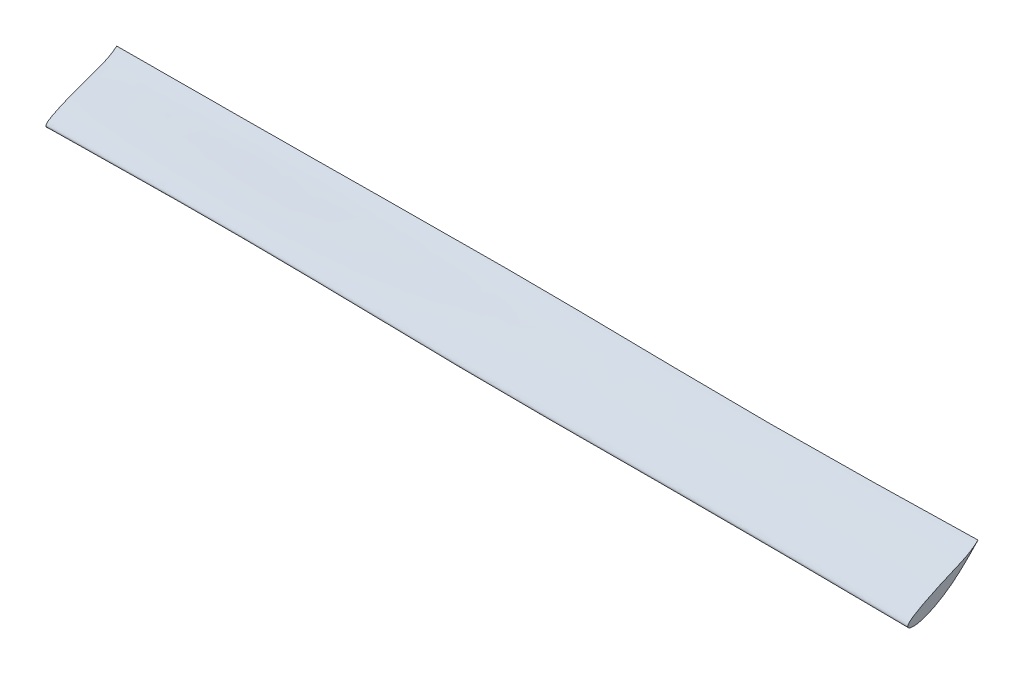
ISO-10303-21;
HEADER;
FILE_DESCRIPTION(('STEP AP214'),'2;1');
FILE_NAME('part.step','',(''),(''),'','','');
FILE_SCHEMA(('AUTOMOTIVE_DESIGN { 1 0 10303 214 1 1 1 1 }'));
ENDSEC;
DATA;
#1=APPLICATION_CONTEXT('core data for automotive mechanical design processes');
#2=APPLICATION_PROTOCOL_DEFINITION('international standard','automotive_design',2000,#1);
#3=PRODUCT_CONTEXT('',#1,'mechanical');
#4=PRODUCT('Part','Part','',(#3));
#5=PRODUCT_RELATED_PRODUCT_CATEGORY('part','',(#4));
#6=PRODUCT_DEFINITION_FORMATION('','',#4);
#7=PRODUCT_DEFINITION_CONTEXT('part definition',#1,'design');
#8=PRODUCT_DEFINITION('design','',#6,#7);
#9=PRODUCT_DEFINITION_SHAPE('','',#8);
#10=(LENGTH_UNIT() NAMED_UNIT(*) SI_UNIT(.MILLI.,.METRE.));
#11=(NAMED_UNIT(*) PLANE_ANGLE_UNIT() SI_UNIT($,.RADIAN.));
#12=(NAMED_UNIT(*) SI_UNIT($,.STERADIAN.) SOLID_ANGLE_UNIT());
#13=UNCERTAINTY_MEASURE_WITH_UNIT(LENGTH_MEASURE(1.E-05),#10,'distance_accuracy_value','');
#14=(GEOMETRIC_REPRESENTATION_CONTEXT(3) GLOBAL_UNCERTAINTY_ASSIGNED_CONTEXT((#13)) GLOBAL_UNIT_ASSIGNED_CONTEXT((#10,
#11,#12)) REPRESENTATION_CONTEXT('',''));
#15=CARTESIAN_POINT('',(0.,0.,0.));
#16=DIRECTION('',(0.,0.,1.));
#17=DIRECTION('',(1.,0.,0.));
#18=AXIS2_PLACEMENT_3D('',#15,#16,#17);
#19=CARTESIAN_POINT('',(534.287503140715,23.5445932351853,-31.5919798363942));
#20=DIRECTION('',(1.,0.,0.));
#21=DIRECTION('',(0.,0.,-1.));
#22=AXIS2_PLACEMENT_3D('',#19,#20,#21);
#23=PLANE('',#22);
#24=CARTESIAN_POINT('',(534.287503140715,35.4339005781969,-54.10357532692));
#25=CARTESIAN_POINT('',(534.287503140715,34.2381881895794,-52.8955230255901));
#26=CARTESIAN_POINT('',(534.287503140715,32.1428343468748,-50.2360352412443));
#27=CARTESIAN_POINT('',(534.287503140715,29.6938278537414,-45.7981714533343));
#28=CARTESIAN_POINT('',(534.287503140715,27.6735843988713,-41.1787572420392));
#29=CARTESIAN_POINT('',(534.287503140715,25.7176513120445,-36.5225225253925));
#30=CARTESIAN_POINT('',(534.287503140715,23.695720292381,-31.894572560708));
#31=CARTESIAN_POINT('',(534.287503140715,21.5984931931603,-27.3081732984461));
#32=CARTESIAN_POINT('',(534.287503140715,19.4455955790061,-22.7564956841988));
#33=CARTESIAN_POINT('',(534.287503140715,17.5082778691136,-19.0387125988831));
#34=CARTESIAN_POINT('',(534.287503140715,15.8538747820841,-16.1253914306171));
#35=CARTESIAN_POINT('',(534.287503140715,14.7486241627605,-14.3447709325331));
#36=CARTESIAN_POINT('',(534.287503140715,13.798577758102,-12.9569555017875));
#37=CARTESIAN_POINT('',(534.287503140715,13.0042141147821,-11.9524705075148));
#38=CARTESIAN_POINT('',(534.287503140715,11.9509988926326,-10.8600952656026));
#39=CARTESIAN_POINT('',(534.287503140715,10.9287179976586,-10.3342016372565));
#40=CARTESIAN_POINT('',(534.287503140715,10.2024209056551,-10.6788708378612));
#41=B_SPLINE_CURVE_WITH_KNOTS('',3,(#24,#25,#26,#27,#28,#29,#30,#31,#32,#33,#34,#35,#36,#37,#38,
#39,#40),.UNSPECIFIED.,.F.,.F.,(4,1,1,1,1,1,1,1,1,1,1,1,1,1,4),(0.,0.0994502667406111,
0.197535442889514,0.296052562977772,0.394806356808814,0.493450979662712,0.591940996969297,
0.690286731259081,0.788438582066012,0.837480949450307,0.886562535047494,0.911178481655704,
0.935996245563337,0.961487145328943,1.),.UNSPECIFIED.);
#42=CARTESIAN_POINT('',(534.287503140715,10.2024209056551,-10.6788708378612));
#43=VERTEX_POINT('',#42);
#44=CARTESIAN_POINT('',(534.287503140715,35.4339005781969,-54.10357532692));
#45=VERTEX_POINT('',#44);
#46=EDGE_CURVE('E60',#43,#45,#41,.F.);
#47=ORIENTED_EDGE('',*,*,#46,.F.);
#48=CARTESIAN_POINT('',(534.287503140715,10.2024209056551,-10.6788708378612));
#49=CARTESIAN_POINT('',(534.287503140715,9.53216321875651,-11.1904140364192));
#50=CARTESIAN_POINT('',(534.287503140715,9.14745858945485,-12.4362131774804));
#51=CARTESIAN_POINT('',(534.287503140715,9.05729615795471,-14.1752019618341));
#52=CARTESIAN_POINT('',(534.287503140715,9.15989810619456,-15.5901834868764));
#53=CARTESIAN_POINT('',(534.287503140715,9.43036237564233,-17.3559755452917));
#54=CARTESIAN_POINT('',(534.287503140715,9.96453582628308,-19.4660487541451));
#55=CARTESIAN_POINT('',(534.287503140715,11.0827536415392,-22.6853781510137));
#56=CARTESIAN_POINT('',(534.287503140715,12.8232789365591,-26.5267046993073));
#57=CARTESIAN_POINT('',(534.287503140715,15.2532400414026,-30.9385941988985));
#58=CARTESIAN_POINT('',(534.287503140715,17.9854624447831,-35.1779101738743));
#59=CARTESIAN_POINT('',(534.287503140715,21.0567921584213,-39.2152051247754));
#60=CARTESIAN_POINT('',(534.287503140715,24.3934392452951,-43.0946377459128));
#61=CARTESIAN_POINT('',(534.287503140715,27.9556329108987,-46.834343905403));
#62=CARTESIAN_POINT('',(534.287503140715,31.6525993706431,-50.4968423811324));
#63=CARTESIAN_POINT('',(534.287503140715,34.1843384422545,-52.8862952058577));
#64=CARTESIAN_POINT('',(534.287503140715,35.4339005781969,-54.10357532692));
#65=B_SPLINE_CURVE_WITH_KNOTS('',3,(#48,#49,#50,#51,#52,#53,#54,#55,#56,#57,#58,#59,#60,#61,#62,
#63,#64),.UNSPECIFIED.,.F.,.F.,(4,1,1,1,1,1,1,1,1,1,1,1,1,1,4),(0.,0.0439009675766793,
0.0724931974140234,0.0990463982397024,0.124643035702787,0.174283288293371,0.222881713336981,
0.31883035285832,0.41429919096017,0.509891636581509,0.60612378963281,0.703302686626897,
0.801511361886123,0.900533646948853,1.),.UNSPECIFIED.);
#66=EDGE_CURVE('E96',#45,#43,#65,.F.);
#67=ORIENTED_EDGE('',*,*,#66,.F.);
#68=EDGE_LOOP('',(#47,#67));
#69=FACE_BOUND('',#68,.T.);
#70=ADVANCED_FACE('F57',(#69),#23,.T.);
#71=CARTESIAN_POINT('',(0.,23.484223991255,-31.7011060039401));
#72=DIRECTION('',(1.,0.,0.));
#73=DIRECTION('',(0.,0.,-1.));
#74=AXIS2_PLACEMENT_3D('',#71,#72,#73);
#75=PLANE('',#74);
#76=CARTESIAN_POINT('',(0.,33.4718637070637,-54.3097643297301));
#77=CARTESIAN_POINT('',(0.,32.395776073136,-53.0586742504488));
#78=CARTESIAN_POINT('',(0.,30.5468507342221,-50.3408636441683));
#79=CARTESIAN_POINT('',(0.,28.476047650665,-45.8767302196085));
#80=CARTESIAN_POINT('',(0.,26.8328108478623,-41.2658512957863));
#81=CARTESIAN_POINT('',(0.,25.2543553945098,-36.623674473178));
#82=CARTESIAN_POINT('',(0.,23.6100632017207,-32.0044143131714));
#83=CARTESIAN_POINT('',(0.,21.8900292839443,-27.4202880068344));
#84=CARTESIAN_POINT('',(0.,20.1137239707885,-22.8660129390922));
#85=CARTESIAN_POINT('',(0.,18.4896405150433,-19.13397699365));
#86=CARTESIAN_POINT('',(0.,17.084988176991,-16.2002424969715));
#87=CARTESIAN_POINT('',(0.,16.1353498503008,-14.4007637609852));
#88=CARTESIAN_POINT('',(0.,15.3093801529886,-12.9922393722692));
#89=CARTESIAN_POINT('',(0.,14.6081852314093,-11.9655257350319));
#90=CARTESIAN_POINT('',(0.,13.662257675184,-10.8361332014463));
#91=CARTESIAN_POINT('',(0.,12.7078642109712,-10.2574690494851));
#92=CARTESIAN_POINT('',(0.,11.9810754589233,-10.542010721781));
#93=B_SPLINE_CURVE_WITH_KNOTS('',3,(#76,#77,#78,#79,#80,#81,#82,#83,#84,#85,#86,#87,#88,#89,#90,
#91,#92),.UNSPECIFIED.,.F.,.F.,(4,1,1,1,1,1,1,1,1,1,1,1,1,1,4),(0.,0.0994502667406111,
0.197535442889514,0.296052562977772,0.394806356808814,0.493450979662712,0.591940996969297,
0.690286731259081,0.788438582066012,0.837480949450307,0.886562535047494,0.911178481655704,
0.935996245563337,0.961487145328943,1.),.UNSPECIFIED.);
#94=CARTESIAN_POINT('',(0.,33.4718637070637,-54.3097643297301));
#95=VERTEX_POINT('',#94);
#96=CARTESIAN_POINT('',(0.,11.9810754589233,-10.542010721781));
#97=VERTEX_POINT('',#96);
#98=EDGE_CURVE('E13',#95,#97,#93,.T.);
#99=ORIENTED_EDGE('',*,*,#98,.F.);
#100=CARTESIAN_POINT('',(0.,11.9810754589233,-10.542010721781));
#101=CARTESIAN_POINT('',(0.,11.297240795926,-10.9919689316582));
#102=CARTESIAN_POINT('',(0.,10.8401547295533,-12.1724139891022));
#103=CARTESIAN_POINT('',(0.,10.6348750572766,-13.8504860760179));
#104=CARTESIAN_POINT('',(0.,10.6382631297944,-15.2278368902834));
#105=CARTESIAN_POINT('',(0.,10.7804276026314,-16.9563295140538));
#106=CARTESIAN_POINT('',(0.,11.1546378085893,-19.0361417787975));
#107=CARTESIAN_POINT('',(0.,12.0192446516231,-22.2298709050762));
#108=CARTESIAN_POINT('',(0.,13.4443570594694,-26.0682083226455));
#109=CARTESIAN_POINT('',(0.,15.4984768125264,-30.5058941070354));
#110=CARTESIAN_POINT('',(0.,17.8570386432198,-34.796947575819));
#111=CARTESIAN_POINT('',(0.,20.5577249067278,-38.9153485367814));
#112=CARTESIAN_POINT('',(0.,23.5260756529886,-42.8988588139013));
#113=CARTESIAN_POINT('',(0.,26.7223431998189,-46.76234503904));
#114=CARTESIAN_POINT('',(0.,30.0543735669652,-50.5601984947121));
#115=CARTESIAN_POINT('',(0.,32.3442492337358,-53.0460845084862));
#116=CARTESIAN_POINT('',(0.,33.4718637070637,-54.3097643297301));
#117=B_SPLINE_CURVE_WITH_KNOTS('',3,(#100,#101,#102,#103,#104,#105,#106,#107,#108,#109,#110,
#111,#112,#113,#114,#115,#116),.UNSPECIFIED.,.F.,.F.,(4,1,1,1,1,1,1,1,1,1,1,1,1,1,4),(0.,
0.0439009675766793,0.0724931974140234,0.0990463982397024,0.124643035702787,0.174283288293371,
0.222881713336981,0.31883035285832,0.41429919096017,0.509891636581509,0.60612378963281,
0.703302686626897,0.801511361886123,0.900533646948853,1.),.UNSPECIFIED.);
#118=EDGE_CURVE('E82',#97,#95,#117,.T.);
#119=ORIENTED_EDGE('',*,*,#118,.F.);
#120=EDGE_LOOP('',(#99,#119));
#121=FACE_BOUND('',#120,.T.);
#122=ADVANCED_FACE('F83',(#121),#75,.F.);
#123=CARTESIAN_POINT('',(0.,33.4718637070637,-54.3097643297301));
#124=CARTESIAN_POINT('',(44.5258381922055,32.8071311986423,-55.1416824970362));
#125=CARTESIAN_POINT('',(133.582723980354,31.4775884098775,-56.8056161638445));
#126=CARTESIAN_POINT('',(267.129991317786,35.6920351360956,-54.2443149838385));
#127=CARTESIAN_POINT('',(400.717033821104,34.3734046494034,-52.0764593753634));
#128=CARTESIAN_POINT('',(489.764075440731,35.0804024281022,-53.4278709517811));
#129=CARTESIAN_POINT('',(534.287503140715,35.4339005781969,-54.10357532692));
#130=CARTESIAN_POINT('',(0.,32.395776073136,-53.0586742504488));
#131=CARTESIAN_POINT('',(44.5258634222231,31.7774066378801,-53.8659113467657));
#132=CARTESIAN_POINT('',(133.582799662574,30.5405938902134,-55.4804799371278));
#133=CARTESIAN_POINT('',(267.129996766008,34.4713153162008,-53.0246132913862));
#134=CARTESIAN_POINT('',(400.717086447841,33.2225955468438,-50.9598679405982));
#135=CARTESIAN_POINT('',(489.764092982953,33.8996577806364,-52.2503055634689));
#136=CARTESIAN_POINT('',(534.287503140715,34.2381881895794,-52.8955230255901));
#137=CARTESIAN_POINT('',(0.,30.5468507342221,-50.3408636441683));
#138=CARTESIAN_POINT('',(44.5259135359419,30.0198359722681,-51.0968139040359));
#139=CARTESIAN_POINT('',(133.582949988173,28.965740221276,-52.6088027280232));
#140=CARTESIAN_POINT('',(267.130007587668,32.3307002746058,-50.355567308038));
#141=CARTESIAN_POINT('',(400.717190978942,31.2186370607495,-48.4888366255899));
#142=CARTESIAN_POINT('',(489.764127826604,31.8347690143284,-49.6536365146556));
#143=CARTESIAN_POINT('',(534.287503140715,32.1428343468748,-50.2360352412443));
#144=CARTESIAN_POINT('',(0.,28.476047650665,-45.8767302196085));
#145=CARTESIAN_POINT('',(44.5259886429438,28.0852095696248,-46.5507202898205));
#146=CARTESIAN_POINT('',(133.583175285863,27.3034785593498,-47.8987790059112));
#147=CARTESIAN_POINT('',(267.130023806429,29.818295943037,-45.9339479493417));
#148=CARTESIAN_POINT('',(400.717347642982,28.9088258663352,-44.348702857731));
#149=CARTESIAN_POINT('',(489.764180047878,29.4321608894142,-45.3150159284007));
#150=CARTESIAN_POINT('',(534.287503140715,29.6938278537414,-45.7981714533343));
#151=CARTESIAN_POINT('',(0.,26.8328108478623,-41.2658512957863));
#152=CARTESIAN_POINT('',(44.5260635732541,26.5778546727614,-41.8551787588738));
#153=CARTESIAN_POINT('',(133.583400053533,26.0678988294787,-43.0339022162827));
#154=CARTESIAN_POINT('',(267.130039987036,27.7346502875662,-41.3481111153856));
#155=CARTESIAN_POINT('',(400.717503938464,27.0273734971272,-40.0350036010102));
#156=CARTESIAN_POINT('',(489.764232146299,27.4581810652654,-40.7975065598911));
#157=CARTESIAN_POINT('',(534.287503140715,27.6735843988713,-41.1787572420392));
#158=CARTESIAN_POINT('',(0.,25.2543553945098,-36.623674473178));
#159=CARTESIAN_POINT('',(44.5261386454931,25.1355587651846,-37.1277201006763));
#160=CARTESIAN_POINT('',(133.583625246945,24.8979333924459,-38.1358697697625));
#161=CARTESIAN_POINT('',(267.13005619829,25.7150733485101,-36.7282705330581));
#162=CARTESIAN_POINT('',(400.717660529992,25.2104336083452,-35.6864394489704));
#163=CARTESIAN_POINT('',(489.764284343403,25.5485789798602,-36.2438285551318));
#164=CARTESIAN_POINT('',(534.287503140715,25.7176513120445,-36.5225225253925));
#165=CARTESIAN_POINT('',(0.,23.6100632017207,-32.0044143131714));
#166=CARTESIAN_POINT('',(44.5262137108564,23.6273973336696,-32.4236331450197));
#167=CARTESIAN_POINT('',(133.583850419731,23.6620448595206,-33.2621191589125));
#168=CARTESIAN_POINT('',(267.13007240806,23.6296021866973,-32.1340280299989));
#169=CARTESIAN_POINT('',(400.717817107178,23.3275319955944,-31.3647902350264));
#170=CARTESIAN_POINT('',(489.764336535725,23.5729910312242,-31.7179786983493));
#171=CARTESIAN_POINT('',(534.287503140715,23.695720292381,-31.894572560708));
#172=CARTESIAN_POINT('',(0.,21.8900292839443,-27.4202880068344));
#173=CARTESIAN_POINT('',(44.526288672697,22.0433001763863,-27.7553307609928));
#174=CARTESIAN_POINT('',(133.584075281982,22.3498325828433,-28.4254546319369));
#175=CARTESIAN_POINT('',(267.130088595475,21.4689601506448,-27.5780873845331));
#176=CARTESIAN_POINT('',(400.717973468428,21.369161356006,-27.0826681669533));
#177=CARTESIAN_POINT('',(489.764388656069,21.5220493540179,-27.2330050260791));
#178=CARTESIAN_POINT('',(534.287503140715,21.5984931931603,-27.3081732984461));
#179=CARTESIAN_POINT('',(0.,20.1137239707885,-22.8660129390922));
#180=CARTESIAN_POINT('',(44.5263635095239,20.4027025752845,-23.1174255433543));
#181=CARTESIAN_POINT('',(133.584299769231,20.9806617462505,-23.6202791910412));
#182=CARTESIAN_POINT('',(267.130104755894,19.2527674382483,-23.054384337695));
#183=CARTESIAN_POINT('',(400.718129568916,19.354895671462,-22.8335437095574));
#184=CARTESIAN_POINT('',(489.764440689493,19.4153623186417,-22.7821783235124));
#185=CARTESIAN_POINT('',(534.287503140715,19.4455955790061,-22.7564956841988));
#186=CARTESIAN_POINT('',(0.,18.4896405150433,-19.13397699365));
#187=CARTESIAN_POINT('',(44.5264258017381,18.8915979397106,-19.3167856092358));
#188=CARTESIAN_POINT('',(133.584486626536,19.6955241927274,-19.6824231374199));
#189=CARTESIAN_POINT('',(267.130118207404,17.2626488935387,-19.3538412841263));
#190=CARTESIAN_POINT('',(400.718259502872,17.532913722982,-19.3645753927808));
#191=CARTESIAN_POINT('',(489.764484000751,17.5164898089542,-19.1473333787465));
#192=CARTESIAN_POINT('',(534.287503140715,17.5082778691136,-19.0387125988831));
#193=CARTESIAN_POINT('',(0.,17.084988176991,-16.2002424969715));
#194=CARTESIAN_POINT('',(44.526475595893,17.5773099254672,-16.3289632201816));
#195=CARTESIAN_POINT('',(133.584635993542,18.5619723796781,-16.5864185430152));
#196=CARTESIAN_POINT('',(267.130128960056,15.5657200041711,-16.4497912279675));
#197=CARTESIAN_POINT('',(400.718363367401,15.9705465408255,-16.6478928831641));
#198=CARTESIAN_POINT('',(489.764518622213,15.8927653141112,-16.2995583386479));
#199=CARTESIAN_POINT('',(534.287503140715,15.8538747820841,-16.1253914306171));
#200=CARTESIAN_POINT('',(0.,16.1353498503008,-14.4007637609852));
#201=CARTESIAN_POINT('',(44.5265067343698,16.6842277078845,-14.4961686796519));
#202=CARTESIAN_POINT('',(133.584729399306,17.7820071094308,-14.6869884377191));
#203=CARTESIAN_POINT('',(267.130135684164,14.4335922132998,-14.6719219916717));
#204=CARTESIAN_POINT('',(400.718428318464,14.9227080699532,-14.9887160474423));
#205=CARTESIAN_POINT('',(489.764540272536,14.806652050924,-14.5594190049136));
#206=CARTESIAN_POINT('',(534.287503140715,14.7486241627605,-14.3447709325331));
#207=CARTESIAN_POINT('',(0.,15.3093801529886,-12.9922393722692));
#208=CARTESIAN_POINT('',(44.5265317271902,15.9037204951493,-13.0613682574719));
#209=CARTESIAN_POINT('',(133.584804370009,17.0924286696303,-13.1996328279777));
#210=CARTESIAN_POINT('',(267.130141081165,13.4615617137572,-13.2835285414411));
#211=CARTESIAN_POINT('',(400.718480450437,14.0185368773884,-13.696982405728));
#212=CARTESIAN_POINT('',(489.764557649837,13.8718973623108,-13.2036307925271));
#213=CARTESIAN_POINT('',(534.287503140715,13.798577758102,-12.9569555017875));
#214=CARTESIAN_POINT('',(0.,14.6081852314093,-11.9655257350319));
#215=CARTESIAN_POINT('',(44.5265507351758,15.2372012047015,-12.0152105885667));
#216=CARTESIAN_POINT('',(133.584861388065,16.4952635460282,-12.1145847855423));
#217=CARTESIAN_POINT('',(267.130145185789,12.6498801936837,-12.2753646673341));
#218=CARTESIAN_POINT('',(400.718520098775,13.2587640061472,-12.7639516529895));
#219=CARTESIAN_POINT('',(489.764570865931,13.0890639602754,-12.2229638455594));
#220=CARTESIAN_POINT('',(534.287503140715,13.0042141147821,-11.9524705075148));
#221=CARTESIAN_POINT('',(0.,13.662257675184,-10.8361332014463));
#222=CARTESIAN_POINT('',(44.5265732687349,14.3326443506845,-10.8636563729816));
#223=CARTESIAN_POINT('',(133.584928981747,15.6734515705756,-10.918704571259));
#224=CARTESIAN_POINT('',(267.130150051732,11.5745541087573,-11.1732954584523));
#225=CARTESIAN_POINT('',(400.718567101029,12.2457649774022,-11.7536175848234));
#226=CARTESIAN_POINT('',(489.764586533327,12.049254117238,-11.1579356234361));
#227=CARTESIAN_POINT('',(534.287503140715,11.9509988926326,-10.8600952656026));
#228=CARTESIAN_POINT('',(0.,12.7078642109712,-10.2574690494851));
#229=CARTESIAN_POINT('',(44.5265895061559,13.4088473606944,-10.2711974397361));
#230=CARTESIAN_POINT('',(133.584977688969,14.8108501243309,-10.298654431342));
#231=CARTESIAN_POINT('',(267.130153558074,10.5316290833572,-10.6273686227057));
#232=CARTESIAN_POINT('',(400.718600970307,11.2501078163794,-11.2803181210003));
#233=CARTESIAN_POINT('',(489.764597823071,11.0358477878751,-10.6495733588227));
#234=CARTESIAN_POINT('',(534.287503140715,10.9287179976586,-10.3342016372565));
#235=CARTESIAN_POINT('',(0.,11.9810754589233,-10.542010721781));
#236=CARTESIAN_POINT('',(44.5265992766677,12.7039144504272,-10.5498028834548));
#237=CARTESIAN_POINT('',(133.585006997471,14.1496308623555,-10.565386705241));
#238=CARTESIAN_POINT('',(267.130155667939,9.77223959703539,-10.9457965938144));
#239=CARTESIAN_POINT('',(400.718621350402,10.5294961225369,-11.6495415489469));
#240=CARTESIAN_POINT('',(489.764604616426,10.3114458259498,-11.0024272904638));
#241=CARTESIAN_POINT('',(534.287503140715,10.2024209056551,-10.6788708378612));
#242=B_SPLINE_SURFACE_WITH_KNOTS('',3,3,((#123,#124,#125,#126,#127,#128,#129),(#130,#131,#132,
#133,#134,#135,#136),(#137,#138,#139,#140,#141,#142,#143),(#144,#145,#146,#147,#148,#149,#150),
(#151,#152,#153,#154,#155,#156,#157),(#158,#159,#160,#161,#162,#163,#164),(#165,#166,#167,#168,
#169,#170,#171),(#172,#173,#174,#175,#176,#177,#178),(#179,#180,#181,#182,#183,#184,#185),(#186,
#187,#188,#189,#190,#191,#192),(#193,#194,#195,#196,#197,#198,#199),(#200,#201,#202,#203,#204,
#205,#206),(#207,#208,#209,#210,#211,#212,#213),(#214,#215,#216,#217,#218,#219,#220),(#221,#222,
#223,#224,#225,#226,#227),(#228,#229,#230,#231,#232,#233,#234),(#235,#236,#237,#238,#239,#240,
#241)),.UNSPECIFIED.,.F.,.F.,.F.,(4,1,1,1,1,1,1,1,1,1,1,1,1,1,4),(4,1,1,1,4),(0.,
0.0994502667406111,0.197535442889514,0.296052562977772,0.394806356808814,0.493450979662712,
0.591940996969297,0.690286731259081,0.788438582066012,0.837480949450307,0.886562535047494,
0.911178481655704,0.935996245563337,0.961487145328943,1.),(0.,0.249997499834614,
0.500024248706702,0.750012647140591,1.),.UNSPECIFIED.);
#243=CARTESIAN_POINT('',(0.,11.9810754589233,-10.542010721781));
#244=CARTESIAN_POINT('',(44.5265992766677,12.7039144504272,-10.5498028834548));
#245=CARTESIAN_POINT('',(133.585006997471,14.1496308623555,-10.565386705241));
#246=CARTESIAN_POINT('',(267.130155667939,9.77223959703539,-10.9457965938144));
#247=CARTESIAN_POINT('',(400.718621350402,10.5294961225369,-11.6495415489469));
#248=CARTESIAN_POINT('',(489.764604616426,10.3114458259498,-11.0024272904638));
#249=CARTESIAN_POINT('',(534.287503140715,10.2024209056551,-10.6788708378612));
#250=B_SPLINE_CURVE_WITH_KNOTS('',3,(#243,#244,#245,#246,#247,#248,#249),.UNSPECIFIED.,.F.,.F.,
(4,1,1,1,4),(0.,0.249997499834614,0.500024248706702,0.750012647140591,1.),.UNSPECIFIED.);
#251=EDGE_CURVE('E94',#43,#97,#250,.F.);
#252=CARTESIAN_POINT('',(0.,33.4718637070637,-54.3097643297301));
#253=CARTESIAN_POINT('',(44.5258381922055,32.8071311986423,-55.1416824970362));
#254=CARTESIAN_POINT('',(133.582723980354,31.4775884098775,-56.8056161638445));
#255=CARTESIAN_POINT('',(267.129991317786,35.6920351360956,-54.2443149838385));
#256=CARTESIAN_POINT('',(400.717033821104,34.3734046494034,-52.0764593753634));
#257=CARTESIAN_POINT('',(489.764075440731,35.0804024281022,-53.4278709517811));
#258=CARTESIAN_POINT('',(534.287503140715,35.4339005781969,-54.10357532692));
#259=B_SPLINE_CURVE_WITH_KNOTS('',3,(#252,#253,#254,#255,#256,#257,#258),.UNSPECIFIED.,.F.,.F.,
(4,1,1,1,4),(0.,0.249997499834614,0.500024248706702,0.750012647140591,1.),.UNSPECIFIED.);
#260=EDGE_CURVE('E89',#95,#45,#259,.T.);
#261=ORIENTED_EDGE('',*,*,#98,.T.);
#262=ORIENTED_EDGE('',*,*,#251,.F.);
#263=ORIENTED_EDGE('',*,*,#46,.T.);
#264=ORIENTED_EDGE('',*,*,#260,.F.);
#265=EDGE_LOOP('',(#261,#262,#263,#264));
#266=FACE_BOUND('',#265,.T.);
#267=ADVANCED_FACE('F93',(#266),#242,.T.);
#268=CARTESIAN_POINT('',(0.,11.9810754589233,-10.542010721781));
#269=CARTESIAN_POINT('',(44.5265992766677,12.7039144504272,-10.5498028834548));
#270=CARTESIAN_POINT('',(133.585006997471,14.1496308623555,-10.565386705241));
#271=CARTESIAN_POINT('',(267.130155667939,9.77223959703539,-10.9457965938144));
#272=CARTESIAN_POINT('',(400.718621350402,10.5294961225369,-11.6495415489469));
#273=CARTESIAN_POINT('',(489.764604616426,10.3114458259498,-11.0024272904638));
#274=CARTESIAN_POINT('',(534.287503140715,10.2024209056551,-10.6788708378612));
#275=CARTESIAN_POINT('',(0.,11.297240795926,-10.9919689316582));
#276=CARTESIAN_POINT('',(44.5265881392196,11.9963443266852,-11.0173714351274));
#277=CARTESIAN_POINT('',(133.584973588585,13.3945877153547,-11.0681780215477));
#278=CARTESIAN_POINT('',(267.130153262895,9.13263552314652,-11.4221914663523));
#279=CARTESIAN_POINT('',(400.718598119045,9.8492234444848,-12.1005657254381));
#280=CARTESIAN_POINT('',(489.764596872651,9.63784981332088,-11.4937975097908));
#281=CARTESIAN_POINT('',(534.287503140715,9.53216321875651,-11.1904140364192));
#282=CARTESIAN_POINT('',(0.,10.8401547295533,-12.1724139891022));
#283=CARTESIAN_POINT('',(44.5265697480709,11.5042276001351,-12.2238679125585));
#284=CARTESIAN_POINT('',(133.584918420848,12.8324066849335,-12.3267804210492));
#285=CARTESIAN_POINT('',(267.130149291472,8.77356848846641,-12.6281204107671));
#286=CARTESIAN_POINT('',(400.718559757353,9.43549130157714,-13.2555151439052));
#287=CARTESIAN_POINT('',(489.764584085439,9.24346935964029,-12.7093134522072));
#288=CARTESIAN_POINT('',(534.287503140715,9.14745858945485,-12.4362131774804));
#289=CARTESIAN_POINT('',(0.,10.6348750572766,-13.8504860760179));
#290=CARTESIAN_POINT('',(44.5265446205126,11.252437995884,-13.9351690621181));
#291=CARTESIAN_POINT('',(133.584843045974,12.4875932985731,-14.1045436302661));
#292=CARTESIAN_POINT('',(267.130143865376,8.71032274502219,-14.3268226185332));
#293=CARTESIAN_POINT('',(400.718507344334,9.3016133163942,-14.8774708368713));
#294=CARTESIAN_POINT('',(489.764566614456,9.13873509722816,-14.4092912604863));
#295=CARTESIAN_POINT('',(534.287503140715,9.05729615795471,-14.1752019618341));
#296=CARTESIAN_POINT('',(0.,10.6382631297944,-15.2278368902834));
#297=CARTESIAN_POINT('',(44.5265241366681,11.218359007244,-15.3386056785712));
#298=CARTESIAN_POINT('',(133.584781600799,12.3785770459195,-15.5601549410989));
#299=CARTESIAN_POINT('',(267.130139442052,8.83218161445888,-15.7149767340653));
#300=CARTESIAN_POINT('',(400.718464617534,9.36723591986947,-16.2000545543178));
#301=CARTESIAN_POINT('',(489.76455237221,9.22901061439829,-15.7934735592693));
#302=CARTESIAN_POINT('',(534.287503140715,9.15989810619456,-15.5901834868764));
#303=CARTESIAN_POINT('',(0.,10.7804276026314,-16.9563295140538));
#304=CARTESIAN_POINT('',(44.5264983130493,11.3135579711782,-17.0991391403629));
#305=CARTESIAN_POINT('',(133.584704137959,12.3798410627853,-17.384773875576));
#306=CARTESIAN_POINT('',(267.130133865646,9.12531146627642,-17.4520183045953));
#307=CARTESIAN_POINT('',(400.718410752617,9.59027536944251,-17.8518974469304));
#308=CARTESIAN_POINT('',(489.764534417262,9.48366663259387,-17.5212826153718));
#309=CARTESIAN_POINT('',(534.287503140715,9.43036237564233,-17.3559755452917));
#310=CARTESIAN_POINT('',(0.,11.1546378085893,-19.0361417787975));
#311=CARTESIAN_POINT('',(44.5264668966712,11.6309541665599,-19.2166717922837));
#312=CARTESIAN_POINT('',(133.584609898578,12.5836044945685,-19.5777517733709));
#313=CARTESIAN_POINT('',(267.130127081528,9.68512091252207,-19.5346725196293));
#314=CARTESIAN_POINT('',(400.718345221887,10.065783782298,-19.8271218811138));
#315=CARTESIAN_POINT('',(489.764512573716,9.99828509790249,-19.5864062953358));
#316=CARTESIAN_POINT('',(534.287503140715,9.96453582628308,-19.4660487541451));
#317=CARTESIAN_POINT('',(0.,12.0192446516231,-22.2298709050762));
#318=CARTESIAN_POINT('',(44.5264176323546,12.4067013511789,-22.4677296125052));
#319=CARTESIAN_POINT('',(133.584462120921,13.1816249527015,-22.9434737802582));
#320=CARTESIAN_POINT('',(267.13011644329,10.8421532491073,-22.721931784618));
#321=CARTESIAN_POINT('',(400.718242462535,11.091315658966,-22.8404564327983));
#322=CARTESIAN_POINT('',(489.764478320647,11.0856076433692,-22.7370708395401));
#323=CARTESIAN_POINT('',(534.287503140715,11.0827536415392,-22.6853781510137));
#324=CARTESIAN_POINT('',(0.,13.4443570594694,-26.0682083226455));
#325=CARTESIAN_POINT('',(44.5263567415632,13.7221454822391,-26.3745376936532));
#326=CARTESIAN_POINT('',(133.58427946745,14.2777233908439,-26.987231312513));
#327=CARTESIAN_POINT('',(267.130103294407,12.6296787750417,-26.5379456856827));
#328=CARTESIAN_POINT('',(400.718115451776,12.7167936693853,-26.434335811778));
#329=CARTESIAN_POINT('',(489.764435983786,12.7877838969873,-26.4959151130568));
#330=CARTESIAN_POINT('',(534.287503140715,12.8232789365591,-26.5267046993073));
#331=CARTESIAN_POINT('',(0.,15.4984768125264,-30.5058941070354));
#332=CARTESIAN_POINT('',(44.5262839286322,15.6450137486673,-30.8916528540325));
#333=CARTESIAN_POINT('',(133.584061051261,15.9380777422796,-31.6632146530983));
#334=CARTESIAN_POINT('',(267.130087571032,15.1165064977887,-30.9342514371162));
#335=CARTESIAN_POINT('',(400.717963572888,15.0095137244932,-30.5576714205218));
#336=CARTESIAN_POINT('',(489.764385357561,15.1719980490313,-30.811620116463));
#337=CARTESIAN_POINT('',(534.287503140715,15.2532400414026,-30.9385941988985));
#338=CARTESIAN_POINT('',(0.,17.8570386432198,-34.796947575819));
#339=CARTESIAN_POINT('',(44.5262110437752,17.8719817721367,-35.2600545382452));
#340=CARTESIAN_POINT('',(133.583842419316,17.9018471738764,-36.18632195304));
#341=CARTESIAN_POINT('',(267.130071832125,17.9069276846248,-35.1709258363888));
#342=CARTESIAN_POINT('',(400.717811543972,17.604997488066,-34.5146270789783));
#343=CARTESIAN_POINT('',(489.764334681326,17.8586409693547,-34.9568161171517));
#344=CARTESIAN_POINT('',(534.287503140715,17.9854624447831,-35.1779101738743));
#345=CARTESIAN_POINT('',(0.,20.5577249067278,-38.9153485367814));
#346=CARTESIAN_POINT('',(44.5261377250852,20.4398541738765,-39.4538424259905));
#347=CARTESIAN_POINT('',(133.583622486007,20.2040807582131,-40.5308926505616));
#348=CARTESIAN_POINT('',(267.130055999535,21.0394231712865,-39.2200934343191));
#349=CARTESIAN_POINT('',(400.717658610133,20.5400849032994,-38.2751458002069));
#350=CARTESIAN_POINT('',(489.764283703451,20.8845566468396,-38.9018524534527));
#351=CARTESIAN_POINT('',(534.287503140715,21.0567921584213,-39.2152051247754));
#352=CARTESIAN_POINT('',(0.,23.5260756529886,-42.8988588139013));
#353=CARTESIAN_POINT('',(44.5260637426713,23.2737135545849,-43.5115689763462));
#354=CARTESIAN_POINT('',(133.583400561732,22.7689461579257,-44.7370605678684));
#355=CARTESIAN_POINT('',(267.13004002362,24.4406408703825,-43.1226246390184));
#356=CARTESIAN_POINT('',(400.717504291847,23.7406818742234,-41.8808557336009));
#357=CARTESIAN_POINT('',(489.764232264094,24.175853758289,-42.6900443058808));
#358=CARTESIAN_POINT('',(534.287503140715,24.3934392452951,-43.0946377459128));
#359=CARTESIAN_POINT('',(0.,26.7223431998189,-46.76234503904));
#360=CARTESIAN_POINT('',(44.5259890524153,26.333711802395,-47.448422684417));
#361=CARTESIAN_POINT('',(133.583176514151,25.5563943927044,-48.8206579642911));
#362=CARTESIAN_POINT('',(267.130023894851,28.0709698599245,-46.8950034806562));
#363=CARTESIAN_POINT('',(400.717348497089,27.1669971570833,-45.3488967331715));
#364=CARTESIAN_POINT('',(489.76418033258,27.6927546927904,-46.3391955383134));
#365=CARTESIAN_POINT('',(534.287503140715,27.9556329108987,-46.834343905403));
#366=CARTESIAN_POINT('',(0.,30.0543735669652,-50.5601984947121));
#367=CARTESIAN_POINT('',(44.5259137818436,29.5280946833965,-51.3193292377601));
#368=CARTESIAN_POINT('',(133.582950725802,28.4754707603627,-52.8376793997596));
#369=CARTESIAN_POINT('',(267.130007640768,31.8385175546181,-50.5957349659538));
#370=CARTESIAN_POINT('',(400.717191491863,30.7279877463042,-48.7402724775145));
#371=CARTESIAN_POINT('',(489.764127997578,31.3443959255514,-49.9113198962443));
#372=CARTESIAN_POINT('',(534.287503140715,31.6525993706431,-50.4968423811324));
#373=CARTESIAN_POINT('',(0.,32.3442492337358,-53.0460845084862));
#374=CARTESIAN_POINT('',(44.5258634263041,31.7256953365386,-53.853597189851));
#375=CARTESIAN_POINT('',(133.582799674816,30.4885136431602,-55.468716982544));
#376=CARTESIAN_POINT('',(267.129996766889,34.4186132766273,-53.0137061454181));
#377=CARTESIAN_POINT('',(400.717086456354,33.1693289239847,-50.9498162159412));
#378=CARTESIAN_POINT('',(489.76409298579,33.8460024078624,-52.2408031091445));
#379=CARTESIAN_POINT('',(534.287503140715,34.1843384422545,-52.8862952058577));
#380=CARTESIAN_POINT('',(0.,33.4718637070637,-54.3097643297301));
#381=CARTESIAN_POINT('',(44.5258381922055,32.8071311986423,-55.1416824970362));
#382=CARTESIAN_POINT('',(133.582723980354,31.4775884098775,-56.8056161638445));
#383=CARTESIAN_POINT('',(267.129991317786,35.6920351360956,-54.2443149838385));
#384=CARTESIAN_POINT('',(400.717033821104,34.3734046494034,-52.0764593753634));
#385=CARTESIAN_POINT('',(489.764075440731,35.0804024281022,-53.4278709517811));
#386=CARTESIAN_POINT('',(534.287503140715,35.4339005781969,-54.10357532692));
#387=B_SPLINE_SURFACE_WITH_KNOTS('',3,3,((#268,#269,#270,#271,#272,#273,#274),(#275,#276,#277,
#278,#279,#280,#281),(#282,#283,#284,#285,#286,#287,#288),(#289,#290,#291,#292,#293,#294,#295),
(#296,#297,#298,#299,#300,#301,#302),(#303,#304,#305,#306,#307,#308,#309),(#310,#311,#312,#313,
#314,#315,#316),(#317,#318,#319,#320,#321,#322,#323),(#324,#325,#326,#327,#328,#329,#330),(#331,
#332,#333,#334,#335,#336,#337),(#338,#339,#340,#341,#342,#343,#344),(#345,#346,#347,#348,#349,
#350,#351),(#352,#353,#354,#355,#356,#357,#358),(#359,#360,#361,#362,#363,#364,#365),(#366,#367,
#368,#369,#370,#371,#372),(#373,#374,#375,#376,#377,#378,#379),(#380,#381,#382,#383,#384,#385,
#386)),.UNSPECIFIED.,.F.,.F.,.F.,(4,1,1,1,1,1,1,1,1,1,1,1,1,1,4),(4,1,1,1,4),(0.,
0.0439009675766793,0.0724931974140234,0.0990463982397024,0.124643035702787,0.174283288293371,
0.222881713336981,0.31883035285832,0.41429919096017,0.509891636581509,0.60612378963281,
0.703302686626897,0.801511361886123,0.900533646948853,1.),(0.,0.249997499834614,
0.500024248706702,0.750012647140591,1.),.UNSPECIFIED.);
#388=ORIENTED_EDGE('',*,*,#118,.T.);
#389=ORIENTED_EDGE('',*,*,#260,.T.);
#390=ORIENTED_EDGE('',*,*,#66,.T.);
#391=ORIENTED_EDGE('',*,*,#251,.T.);
#392=EDGE_LOOP('',(#388,#389,#390,#391));
#393=FACE_BOUND('',#392,.T.);
#394=ADVANCED_FACE('F95',(#393),#387,.T.);
#395=CLOSED_SHELL('',(#70,#122,#267,#394));
#396=MANIFOLD_SOLID_BREP('B2',#395);
#397=ADVANCED_BREP_SHAPE_REPRESENTATION('',(#18,#396),#14);
#398=SHAPE_DEFINITION_REPRESENTATION(#9,#397);
ENDSEC;
END-ISO-10303-21;
